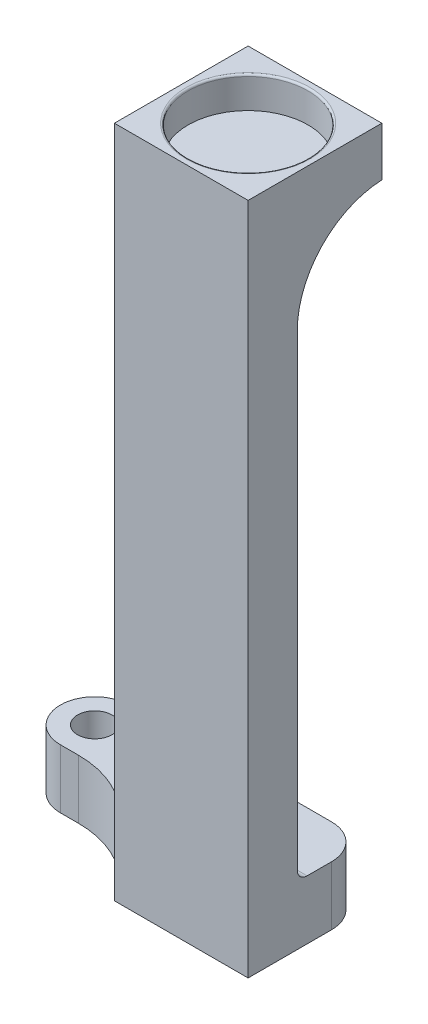
ISO-10303-21;
HEADER;
FILE_DESCRIPTION(('STEP AP214'),'2;1');
FILE_NAME('part.step','',(''),(''),'','','');
FILE_SCHEMA(('AUTOMOTIVE_DESIGN { 1 0 10303 214 1 1 1 1 }'));
ENDSEC;
DATA;
#1=APPLICATION_CONTEXT('core data for automotive mechanical design processes');
#2=APPLICATION_PROTOCOL_DEFINITION('international standard','automotive_design',2000,#1);
#3=PRODUCT_CONTEXT('',#1,'mechanical');
#4=PRODUCT('Part','Part','',(#3));
#5=PRODUCT_RELATED_PRODUCT_CATEGORY('part','',(#4));
#6=PRODUCT_DEFINITION_FORMATION('','',#4);
#7=PRODUCT_DEFINITION_CONTEXT('part definition',#1,'design');
#8=PRODUCT_DEFINITION('design','',#6,#7);
#9=PRODUCT_DEFINITION_SHAPE('','',#8);
#10=(LENGTH_UNIT() NAMED_UNIT(*) SI_UNIT(.MILLI.,.METRE.));
#11=(NAMED_UNIT(*) PLANE_ANGLE_UNIT() SI_UNIT($,.RADIAN.));
#12=(NAMED_UNIT(*) SI_UNIT($,.STERADIAN.) SOLID_ANGLE_UNIT());
#13=UNCERTAINTY_MEASURE_WITH_UNIT(LENGTH_MEASURE(1.E-05),#10,'distance_accuracy_value','');
#14=(GEOMETRIC_REPRESENTATION_CONTEXT(3) GLOBAL_UNCERTAINTY_ASSIGNED_CONTEXT((#13)) GLOBAL_UNIT_ASSIGNED_CONTEXT((#10,
#11,#12)) REPRESENTATION_CONTEXT('',''));
#15=CARTESIAN_POINT('',(0.,0.,0.));
#16=DIRECTION('',(0.,0.,1.));
#17=DIRECTION('',(1.,0.,0.));
#18=AXIS2_PLACEMENT_3D('',#15,#16,#17);
#19=CARTESIAN_POINT('',(-6.8,-63.5,1.8));
#20=DIRECTION('',(0.,0.,1.));
#21=DIRECTION('',(1.,0.,0.));
#22=AXIS2_PLACEMENT_3D('',#19,#20,#21);
#23=PLANE('',#22);
#24=DIRECTION('',(0.,1.,0.));
#25=VECTOR('',#24,1.);
#26=CARTESIAN_POINT('',(6.8,-63.5,1.8));
#27=LINE('',#26,#25);
#28=CARTESIAN_POINT('',(6.8,-56.5,1.8));
#29=VERTEX_POINT('',#28);
#30=CARTESIAN_POINT('',(6.8,-8.99110671719561,1.8));
#31=VERTEX_POINT('',#30);
#32=EDGE_CURVE('E162',#29,#31,#27,.T.);
#33=ORIENTED_EDGE('',*,*,#32,.F.);
#34=DIRECTION('',(1.,0.,0.));
#35=VECTOR('',#34,1.);
#36=CARTESIAN_POINT('',(-6.79999999999999,-56.5,1.8));
#37=LINE('',#36,#35);
#38=CARTESIAN_POINT('',(-6.8,-56.5,1.8));
#39=VERTEX_POINT('',#38);
#40=EDGE_CURVE('E242',#29,#39,#37,.F.);
#41=ORIENTED_EDGE('',*,*,#40,.T.);
#42=DIRECTION('',(0.,1.,0.));
#43=VECTOR('',#42,1.);
#44=CARTESIAN_POINT('',(-6.8,-63.5,1.8));
#45=LINE('',#44,#43);
#46=CARTESIAN_POINT('',(-6.8,-8.99110671719561,1.8));
#47=VERTEX_POINT('',#46);
#48=EDGE_CURVE('E164',#39,#47,#45,.T.);
#49=ORIENTED_EDGE('',*,*,#48,.T.);
#50=DIRECTION('',(1.,0.,0.));
#51=VECTOR('',#50,1.);
#52=CARTESIAN_POINT('',(-6.8,-8.99110671719561,1.8));
#53=LINE('',#52,#51);
#54=EDGE_CURVE('E194',#47,#31,#53,.T.);
#55=ORIENTED_EDGE('',*,*,#54,.T.);
#56=EDGE_LOOP('',(#33,#41,#49,#55));
#57=FACE_BOUND('',#56,.T.);
#58=ADVANCED_FACE('F39',(#57),#23,.F.);
#59=CARTESIAN_POINT('',(6.8,5.,-6.8));
#60=DIRECTION('',(-1.,0.,0.));
#61=DIRECTION('',(0.,0.,1.));
#62=AXIS2_PLACEMENT_3D('',#59,#60,#61);
#63=PLANE('',#62);
#64=DIRECTION('',(0.,0.,1.));
#65=VECTOR('',#64,1.);
#66=CARTESIAN_POINT('',(6.8,-63.5,6.8));
#67=LINE('',#66,#65);
#68=CARTESIAN_POINT('',(6.8,-63.5,-1.7));
#69=VERTEX_POINT('',#68);
#70=CARTESIAN_POINT('',(6.8,-63.5,6.8));
#71=VERTEX_POINT('',#70);
#72=EDGE_CURVE('E135',#69,#71,#67,.T.);
#73=ORIENTED_EDGE('',*,*,#72,.F.);
#74=DIRECTION('',(0.,-1.,0.));
#75=VECTOR('',#74,1.);
#76=CARTESIAN_POINT('',(6.8,5.,-1.7));
#77=LINE('',#76,#75);
#78=CARTESIAN_POINT('',(6.8,-57.5,-1.7));
#79=VERTEX_POINT('',#78);
#80=EDGE_CURVE('E229',#69,#79,#77,.F.);
#81=ORIENTED_EDGE('',*,*,#80,.T.);
#82=DIRECTION('',(0.,0.,1.));
#83=VECTOR('',#82,1.);
#84=CARTESIAN_POINT('',(6.8,-57.5,-5.2));
#85=LINE('',#84,#83);
#86=CARTESIAN_POINT('',(6.8,-57.5,0.799999999999997));
#87=VERTEX_POINT('',#86);
#88=EDGE_CURVE('E145',#79,#87,#85,.T.);
#89=ORIENTED_EDGE('',*,*,#88,.T.);
#90=CARTESIAN_POINT('',(6.8,-56.5,0.799999999999997));
#91=DIRECTION('',(-1.,0.,0.));
#92=DIRECTION('',(0.,0.,1.));
#93=AXIS2_PLACEMENT_3D('',#90,#91,#92);
#94=CIRCLE('',#93,1.);
#95=EDGE_CURVE('E11',#87,#29,#94,.T.);
#96=ORIENTED_EDGE('',*,*,#95,.T.);
#97=ORIENTED_EDGE('',*,*,#32,.T.);
#98=CARTESIAN_POINT('',(6.8,-8.99110671719561,-7.2));
#99=DIRECTION('',(-1.,0.,0.));
#100=DIRECTION('',(0.,0.,1.));
#101=AXIS2_PLACEMENT_3D('',#98,#99,#100);
#102=CIRCLE('',#101,9.);
#103=CARTESIAN_POINT('',(6.8,0.,-6.8));
#104=VERTEX_POINT('',#103);
#105=EDGE_CURVE('E197',#31,#104,#102,.T.);
#106=ORIENTED_EDGE('',*,*,#105,.T.);
#107=DIRECTION('',(0.,-1.,0.));
#108=VECTOR('',#107,1.);
#109=CARTESIAN_POINT('',(6.8,5.,-6.8));
#110=LINE('',#109,#108);
#111=CARTESIAN_POINT('',(6.8,5.,-6.8));
#112=VERTEX_POINT('',#111);
#113=EDGE_CURVE('E185',#112,#104,#110,.T.);
#114=ORIENTED_EDGE('',*,*,#113,.F.);
#115=DIRECTION('',(0.,0.,-1.));
#116=VECTOR('',#115,1.);
#117=CARTESIAN_POINT('',(6.8,5.,-6.8));
#118=LINE('',#117,#116);
#119=CARTESIAN_POINT('',(6.8,5.,6.8));
#120=VERTEX_POINT('',#119);
#121=EDGE_CURVE('E153',#120,#112,#118,.T.);
#122=ORIENTED_EDGE('',*,*,#121,.F.);
#123=DIRECTION('',(0.,-1.,0.));
#124=VECTOR('',#123,1.);
#125=CARTESIAN_POINT('',(6.8,5.,6.8));
#126=LINE('',#125,#124);
#127=EDGE_CURVE('E149',#120,#71,#126,.T.);
#128=ORIENTED_EDGE('',*,*,#127,.T.);
#129=EDGE_LOOP('',(#73,#81,#89,#96,#97,#106,#114,#122,#128));
#130=FACE_BOUND('',#129,.T.);
#131=ADVANCED_FACE('F150',(#130),#63,.F.);
#132=CARTESIAN_POINT('',(-6.8,5.,-6.8));
#133=DIRECTION('',(0.,0.,1.));
#134=DIRECTION('',(1.,0.,0.));
#135=AXIS2_PLACEMENT_3D('',#132,#133,#134);
#136=PLANE('',#135);
#137=DIRECTION('',(-1.,0.,0.));
#138=VECTOR('',#137,1.);
#139=CARTESIAN_POINT('',(-6.8,0.,-6.8));
#140=LINE('',#139,#138);
#141=CARTESIAN_POINT('',(-6.8,0.,-6.8));
#142=VERTEX_POINT('',#141);
#143=EDGE_CURVE('E172',#104,#142,#140,.T.);
#144=ORIENTED_EDGE('',*,*,#143,.T.);
#145=DIRECTION('',(0.,-1.,0.));
#146=VECTOR('',#145,1.);
#147=CARTESIAN_POINT('',(-6.8,5.,-6.8));
#148=LINE('',#147,#146);
#149=CARTESIAN_POINT('',(-6.8,5.,-6.8));
#150=VERTEX_POINT('',#149);
#151=EDGE_CURVE('E182',#150,#142,#148,.T.);
#152=ORIENTED_EDGE('',*,*,#151,.F.);
#153=DIRECTION('',(-1.,0.,0.));
#154=VECTOR('',#153,1.);
#155=CARTESIAN_POINT('',(-6.8,5.,-6.8));
#156=LINE('',#155,#154);
#157=EDGE_CURVE('E174',#112,#150,#156,.T.);
#158=ORIENTED_EDGE('',*,*,#157,.F.);
#159=ORIENTED_EDGE('',*,*,#113,.T.);
#160=EDGE_LOOP('',(#144,#152,#158,#159));
#161=FACE_BOUND('',#160,.T.);
#162=ADVANCED_FACE('F276',(#161),#136,.F.);
#163=CARTESIAN_POINT('',(-6.8,5.,-6.8));
#164=DIRECTION('',(1.,0.,0.));
#165=DIRECTION('',(0.,0.,-1.));
#166=AXIS2_PLACEMENT_3D('',#163,#164,#165);
#167=PLANE('',#166);
#168=ORIENTED_EDGE('',*,*,#48,.F.);
#169=DIRECTION('',(0.,0.,1.));
#170=VECTOR('',#169,1.);
#171=CARTESIAN_POINT('',(-6.8,-56.5,6.8));
#172=LINE('',#171,#170);
#173=CARTESIAN_POINT('',(-6.8,-56.5,6.8));
#174=VERTEX_POINT('',#173);
#175=EDGE_CURVE('E231',#39,#174,#172,.T.);
#176=ORIENTED_EDGE('',*,*,#175,.T.);
#177=DIRECTION('',(0.,-1.,0.));
#178=VECTOR('',#177,1.);
#179=CARTESIAN_POINT('',(-6.8,5.,6.8));
#180=LINE('',#179,#178);
#181=CARTESIAN_POINT('',(-6.8,5.,6.8));
#182=VERTEX_POINT('',#181);
#183=EDGE_CURVE('E180',#182,#174,#180,.T.);
#184=ORIENTED_EDGE('',*,*,#183,.F.);
#185=DIRECTION('',(0.,0.,1.));
#186=VECTOR('',#185,1.);
#187=CARTESIAN_POINT('',(-6.8,5.,-6.8));
#188=LINE('',#187,#186);
#189=EDGE_CURVE('E176',#150,#182,#188,.T.);
#190=ORIENTED_EDGE('',*,*,#189,.F.);
#191=ORIENTED_EDGE('',*,*,#151,.T.);
#192=CARTESIAN_POINT('',(-6.8,-8.99110671719561,-7.2));
#193=DIRECTION('',(1.,0.,0.));
#194=DIRECTION('',(0.,0.,-1.));
#195=AXIS2_PLACEMENT_3D('',#192,#193,#194);
#196=CIRCLE('',#195,9.);
#197=EDGE_CURVE('E199',#142,#47,#196,.T.);
#198=ORIENTED_EDGE('',*,*,#197,.T.);
#199=EDGE_LOOP('',(#168,#176,#184,#190,#191,#198));
#200=FACE_BOUND('',#199,.T.);
#201=ADVANCED_FACE('F295',(#200),#167,.F.);
#202=CARTESIAN_POINT('',(-6.8,5.,6.8));
#203=DIRECTION('',(0.,0.,-1.));
#204=DIRECTION('',(-1.,0.,0.));
#205=AXIS2_PLACEMENT_3D('',#202,#203,#204);
#206=PLANE('',#205);
#207=ORIENTED_EDGE('',*,*,#183,.T.);
#208=CARTESIAN_POINT('',(-6.8,-63.5,6.8));
#209=VERTEX_POINT('',#208);
#210=EDGE_CURVE('E156',#174,#209,#180,.T.);
#211=ORIENTED_EDGE('',*,*,#210,.T.);
#212=DIRECTION('',(-1.,0.,0.));
#213=VECTOR('',#212,1.);
#214=CARTESIAN_POINT('',(-6.8,-63.5,6.8));
#215=LINE('',#214,#213);
#216=EDGE_CURVE('E140',#71,#209,#215,.T.);
#217=ORIENTED_EDGE('',*,*,#216,.F.);
#218=ORIENTED_EDGE('',*,*,#127,.F.);
#219=DIRECTION('',(1.,0.,0.));
#220=VECTOR('',#219,1.);
#221=CARTESIAN_POINT('',(-6.8,5.,6.8));
#222=LINE('',#221,#220);
#223=EDGE_CURVE('E157',#182,#120,#222,.T.);
#224=ORIENTED_EDGE('',*,*,#223,.F.);
#225=EDGE_LOOP('',(#207,#211,#217,#218,#224));
#226=FACE_BOUND('',#225,.T.);
#227=ADVANCED_FACE('F160',(#226),#206,.F.);
#228=CARTESIAN_POINT('',(0.,5.,0.));
#229=DIRECTION('',(0.,1.,0.));
#230=DIRECTION('',(0.,0.,1.));
#231=AXIS2_PLACEMENT_3D('',#228,#229,#230);
#232=PLANE('',#231);
#233=CARTESIAN_POINT('',(0.,5.,0.));
#234=DIRECTION('',(0.,1.,0.));
#235=DIRECTION('',(0.,0.,1.));
#236=AXIS2_PLACEMENT_3D('',#233,#234,#235);
#237=CIRCLE('',#236,6.3);
#238=CARTESIAN_POINT('',(0.,5.,6.3));
#239=VERTEX_POINT('',#238);
#240=EDGE_CURVE('E191',#239,#239,#237,.F.);
#241=ORIENTED_EDGE('',*,*,#240,.T.);
#242=EDGE_LOOP('',(#241));
#243=FACE_BOUND('',#242,.T.);
#244=ORIENTED_EDGE('',*,*,#121,.T.);
#245=ORIENTED_EDGE('',*,*,#157,.T.);
#246=ORIENTED_EDGE('',*,*,#189,.T.);
#247=ORIENTED_EDGE('',*,*,#223,.T.);
#248=EDGE_LOOP('',(#244,#245,#246,#247));
#249=FACE_BOUND('',#248,.T.);
#250=ADVANCED_FACE('F288',(#243,#249),#232,.T.);
#251=CARTESIAN_POINT('',(0.,1.8,0.));
#252=DIRECTION('',(0.,1.,0.));
#253=DIRECTION('',(0.,0.,1.));
#254=AXIS2_PLACEMENT_3D('',#251,#252,#253);
#255=CYLINDRICAL_SURFACE('',#254,6.1);
#256=CARTESIAN_POINT('',(0.,4.8,0.));
#257=DIRECTION('',(0.,1.,0.));
#258=DIRECTION('',(0.,0.,1.));
#259=AXIS2_PLACEMENT_3D('',#256,#257,#258);
#260=CIRCLE('',#259,6.1);
#261=CARTESIAN_POINT('',(0.,4.8,6.1));
#262=VERTEX_POINT('',#261);
#263=EDGE_CURVE('E188',#262,#262,#260,.T.);
#264=ORIENTED_EDGE('',*,*,#263,.T.);
#265=EDGE_LOOP('',(#264));
#266=FACE_BOUND('',#265,.T.);
#267=CARTESIAN_POINT('',(0.,1.8,0.));
#268=DIRECTION('',(0.,1.,0.));
#269=DIRECTION('',(0.,0.,1.));
#270=AXIS2_PLACEMENT_3D('',#267,#268,#269);
#271=CIRCLE('',#270,6.1);
#272=CARTESIAN_POINT('',(0.,1.8,6.1));
#273=VERTEX_POINT('',#272);
#274=EDGE_CURVE('E169',#273,#273,#271,.T.);
#275=ORIENTED_EDGE('',*,*,#274,.F.);
#276=EDGE_LOOP('',(#275));
#277=FACE_BOUND('',#276,.T.);
#278=ADVANCED_FACE('F284',(#266,#277),#255,.F.);
#279=CARTESIAN_POINT('',(0.,1.8,0.));
#280=DIRECTION('',(0.,1.,0.));
#281=DIRECTION('',(0.,0.,1.));
#282=AXIS2_PLACEMENT_3D('',#279,#280,#281);
#283=PLANE('',#282);
#284=ORIENTED_EDGE('',*,*,#274,.T.);
#285=EDGE_LOOP('',(#284));
#286=FACE_BOUND('',#285,.T.);
#287=ADVANCED_FACE('F281',(#286),#283,.T.);
#288=CARTESIAN_POINT('',(0.,-63.5,0.));
#289=DIRECTION('',(0.,-1.,0.));
#290=DIRECTION('',(0.,0.,-1.));
#291=AXIS2_PLACEMENT_3D('',#288,#289,#290);
#292=PLANE('',#291);
#293=CARTESIAN_POINT('',(-10.3,-63.5,-1.7));
#294=DIRECTION('',(0.,1.,0.));
#295=DIRECTION('',(0.,0.,1.));
#296=AXIS2_PLACEMENT_3D('',#293,#294,#295);
#297=CIRCLE('',#296,1.75);
#298=CARTESIAN_POINT('',(-10.3,-63.5,0.0499999999999956));
#299=VERTEX_POINT('',#298);
#300=EDGE_CURVE('E341',#299,#299,#297,.T.);
#301=ORIENTED_EDGE('',*,*,#300,.T.);
#302=EDGE_LOOP('',(#301));
#303=FACE_BOUND('',#302,.T.);
#304=CARTESIAN_POINT('',(-17.3,-63.5,-1.7));
#305=DIRECTION('',(0.,1.,0.));
#306=DIRECTION('',(0.,0.,1.));
#307=AXIS2_PLACEMENT_3D('',#304,#305,#306);
#308=CIRCLE('',#307,1.75);
#309=CARTESIAN_POINT('',(-17.3,-63.5,0.0499999999999964));
#310=VERTEX_POINT('',#309);
#311=EDGE_CURVE('E235',#310,#310,#308,.T.);
#312=ORIENTED_EDGE('',*,*,#311,.T.);
#313=EDGE_LOOP('',(#312));
#314=FACE_BOUND('',#313,.T.);
#315=DIRECTION('',(-1.,0.,0.));
#316=VECTOR('',#315,1.);
#317=CARTESIAN_POINT('',(6.8,-63.5,1.8));
#318=LINE('',#317,#316);
#319=CARTESIAN_POINT('',(-15.4602540378444,-63.5,1.8));
#320=VERTEX_POINT('',#319);
#321=CARTESIAN_POINT('',(-17.3,-63.5,1.8));
#322=VERTEX_POINT('',#321);
#323=EDGE_CURVE('E337',#320,#322,#318,.T.);
#324=ORIENTED_EDGE('',*,*,#323,.T.);
#325=CARTESIAN_POINT('',(-17.3,-63.5,-1.7));
#326=DIRECTION('',(0.,-1.,0.));
#327=DIRECTION('',(0.,0.,-1.));
#328=AXIS2_PLACEMENT_3D('',#325,#326,#327);
#329=CIRCLE('',#328,3.5);
#330=CARTESIAN_POINT('',(-20.8,-63.5,-1.7));
#331=VERTEX_POINT('',#330);
#332=EDGE_CURVE('E222',#322,#331,#329,.T.);
#333=ORIENTED_EDGE('',*,*,#332,.T.);
#334=CARTESIAN_POINT('',(-17.3,-63.5,-1.7));
#335=DIRECTION('',(0.,-1.,0.));
#336=DIRECTION('',(0.,0.,-1.));
#337=AXIS2_PLACEMENT_3D('',#334,#335,#336);
#338=CIRCLE('',#337,3.5);
#339=CARTESIAN_POINT('',(-17.3,-63.5,-5.2));
#340=VERTEX_POINT('',#339);
#341=EDGE_CURVE('E220',#331,#340,#338,.T.);
#342=ORIENTED_EDGE('',*,*,#341,.T.);
#343=DIRECTION('',(-1.,0.,0.));
#344=VECTOR('',#343,1.);
#345=CARTESIAN_POINT('',(6.8,-63.5,-5.2));
#346=LINE('',#345,#344);
#347=CARTESIAN_POINT('',(3.3,-63.5,-5.2));
#348=VERTEX_POINT('',#347);
#349=EDGE_CURVE('E343',#348,#340,#346,.T.);
#350=ORIENTED_EDGE('',*,*,#349,.F.);
#351=CARTESIAN_POINT('',(3.3,-63.5,-1.7));
#352=DIRECTION('',(0.,-1.,0.));
#353=DIRECTION('',(0.,0.,-1.));
#354=AXIS2_PLACEMENT_3D('',#351,#352,#353);
#355=CIRCLE('',#354,3.5);
#356=EDGE_CURVE('E143',#348,#69,#355,.T.);
#357=ORIENTED_EDGE('',*,*,#356,.T.);
#358=ORIENTED_EDGE('',*,*,#72,.T.);
#359=ORIENTED_EDGE('',*,*,#216,.T.);
#360=CARTESIAN_POINT('',(-15.4602540378444,-63.5,11.8));
#361=DIRECTION('',(0.,-1.,0.));
#362=DIRECTION('',(0.,0.,-1.));
#363=AXIS2_PLACEMENT_3D('',#360,#361,#362);
#364=CIRCLE('',#363,10.);
#365=EDGE_CURVE('E208',#209,#320,#364,.F.);
#366=ORIENTED_EDGE('',*,*,#365,.T.);
#367=EDGE_LOOP('',(#324,#333,#342,#350,#357,#358,#359,#366));
#368=FACE_BOUND('',#367,.T.);
#369=ADVANCED_FACE('F138',(#303,#314,#368),#292,.T.);
#370=CARTESIAN_POINT('',(0.,4.8,0.));
#371=DIRECTION('',(0.,1.,0.));
#372=DIRECTION('',(0.,0.,1.));
#373=AXIS2_PLACEMENT_3D('',#370,#371,#372);
#374=TOROIDAL_SURFACE('',#373,6.3,0.2);
#375=ORIENTED_EDGE('',*,*,#240,.F.);
#376=EDGE_LOOP('',(#375));
#377=FACE_BOUND('',#376,.T.);
#378=ORIENTED_EDGE('',*,*,#263,.F.);
#379=EDGE_LOOP('',(#378));
#380=FACE_BOUND('',#379,.T.);
#381=ADVANCED_FACE('F302',(#377,#380),#374,.T.);
#382=CARTESIAN_POINT('',(0.,-8.99110671719561,-7.2));
#383=DIRECTION('',(1.,0.,0.));
#384=DIRECTION('',(0.,0.,-1.));
#385=AXIS2_PLACEMENT_3D('',#382,#383,#384);
#386=CYLINDRICAL_SURFACE('',#385,9.);
#387=ORIENTED_EDGE('',*,*,#197,.F.);
#388=ORIENTED_EDGE('',*,*,#143,.F.);
#389=ORIENTED_EDGE('',*,*,#105,.F.);
#390=ORIENTED_EDGE('',*,*,#54,.F.);
#391=EDGE_LOOP('',(#387,#388,#389,#390));
#392=FACE_BOUND('',#391,.T.);
#393=ADVANCED_FACE('F304',(#392),#386,.F.);
#394=CARTESIAN_POINT('',(0.,0.,1.8));
#395=DIRECTION('',(0.,0.,1.));
#396=DIRECTION('',(1.,0.,0.));
#397=AXIS2_PLACEMENT_3D('',#394,#395,#396);
#398=PLANE('',#397);
#399=DIRECTION('',(1.,0.,0.));
#400=VECTOR('',#399,1.);
#401=CARTESIAN_POINT('',(6.8,-57.5,1.8));
#402=LINE('',#401,#400);
#403=CARTESIAN_POINT('',(-17.3,-57.5,1.8));
#404=VERTEX_POINT('',#403);
#405=CARTESIAN_POINT('',(-15.4602540378444,-57.5,1.8));
#406=VERTEX_POINT('',#405);
#407=EDGE_CURVE('E340',#404,#406,#402,.T.);
#408=ORIENTED_EDGE('',*,*,#407,.F.);
#409=DIRECTION('',(0.,1.,0.));
#410=VECTOR('',#409,1.);
#411=CARTESIAN_POINT('',(-17.3,-63.5,1.8));
#412=LINE('',#411,#410);
#413=EDGE_CURVE('E216',#404,#322,#412,.F.);
#414=ORIENTED_EDGE('',*,*,#413,.T.);
#415=ORIENTED_EDGE('',*,*,#323,.F.);
#416=DIRECTION('',(0.,-1.,0.));
#417=VECTOR('',#416,1.);
#418=CARTESIAN_POINT('',(-15.4602540378444,-57.5,1.8));
#419=LINE('',#418,#417);
#420=EDGE_CURVE('E202',#320,#406,#419,.F.);
#421=ORIENTED_EDGE('',*,*,#420,.T.);
#422=EDGE_LOOP('',(#408,#414,#415,#421));
#423=FACE_BOUND('',#422,.T.);
#424=ADVANCED_FACE('F307',(#423),#398,.T.);
#425=CARTESIAN_POINT('',(6.8,-57.5,-5.2));
#426=DIRECTION('',(0.,-1.,0.));
#427=DIRECTION('',(0.,0.,-1.));
#428=AXIS2_PLACEMENT_3D('',#425,#426,#427);
#429=PLANE('',#428);
#430=CARTESIAN_POINT('',(-10.3,-57.5,-1.7));
#431=DIRECTION('',(0.,1.,0.));
#432=DIRECTION('',(0.,0.,1.));
#433=AXIS2_PLACEMENT_3D('',#430,#431,#432);
#434=CIRCLE('',#433,1.75);
#435=CARTESIAN_POINT('',(-10.3,-57.5,0.0499999999999956));
#436=VERTEX_POINT('',#435);
#437=EDGE_CURVE('E346',#436,#436,#434,.T.);
#438=ORIENTED_EDGE('',*,*,#437,.F.);
#439=EDGE_LOOP('',(#438));
#440=FACE_BOUND('',#439,.T.);
#441=CARTESIAN_POINT('',(-17.3,-57.5,-1.7));
#442=DIRECTION('',(0.,1.,0.));
#443=DIRECTION('',(0.,0.,1.));
#444=AXIS2_PLACEMENT_3D('',#441,#442,#443);
#445=CIRCLE('',#444,1.75);
#446=CARTESIAN_POINT('',(-17.3,-57.5,0.0499999999999964));
#447=VERTEX_POINT('',#446);
#448=EDGE_CURVE('E361',#447,#447,#445,.T.);
#449=ORIENTED_EDGE('',*,*,#448,.F.);
#450=EDGE_LOOP('',(#449));
#451=FACE_BOUND('',#450,.T.);
#452=CARTESIAN_POINT('',(-15.4602540378444,-57.5,11.8));
#453=DIRECTION('',(0.,-1.,0.));
#454=DIRECTION('',(0.,0.,-1.));
#455=AXIS2_PLACEMENT_3D('',#452,#453,#454);
#456=CIRCLE('',#455,10.);
#457=CARTESIAN_POINT('',(-7.8,-57.5,5.37189700800548));
#458=VERTEX_POINT('',#457);
#459=EDGE_CURVE('E205',#406,#458,#456,.T.);
#460=ORIENTED_EDGE('',*,*,#459,.T.);
#461=DIRECTION('',(0.,0.,1.));
#462=VECTOR('',#461,1.);
#463=CARTESIAN_POINT('',(-7.8,-57.5,1.8));
#464=LINE('',#463,#462);
#465=CARTESIAN_POINT('',(-7.8,-57.5,0.799999999999997));
#466=VERTEX_POINT('',#465);
#467=EDGE_CURVE('E240',#458,#466,#464,.F.);
#468=ORIENTED_EDGE('',*,*,#467,.T.);
#469=DIRECTION('',(1.,0.,0.));
#470=VECTOR('',#469,1.);
#471=CARTESIAN_POINT('',(6.8,-57.5,0.799999999999997));
#472=LINE('',#471,#470);
#473=EDGE_CURVE('E238',#466,#87,#472,.T.);
#474=ORIENTED_EDGE('',*,*,#473,.T.);
#475=ORIENTED_EDGE('',*,*,#88,.F.);
#476=CARTESIAN_POINT('',(3.3,-57.5,-1.7));
#477=DIRECTION('',(0.,-1.,0.));
#478=DIRECTION('',(0.,0.,-1.));
#479=AXIS2_PLACEMENT_3D('',#476,#477,#478);
#480=CIRCLE('',#479,3.5);
#481=CARTESIAN_POINT('',(3.3,-57.5,-5.2));
#482=VERTEX_POINT('',#481);
#483=EDGE_CURVE('E210',#79,#482,#480,.F.);
#484=ORIENTED_EDGE('',*,*,#483,.T.);
#485=DIRECTION('',(1.,0.,0.));
#486=VECTOR('',#485,1.);
#487=CARTESIAN_POINT('',(6.8,-57.5,-5.2));
#488=LINE('',#487,#486);
#489=CARTESIAN_POINT('',(-17.3,-57.5,-5.2));
#490=VERTEX_POINT('',#489);
#491=EDGE_CURVE('E349',#490,#482,#488,.T.);
#492=ORIENTED_EDGE('',*,*,#491,.F.);
#493=CARTESIAN_POINT('',(-17.3,-57.5,-1.7));
#494=DIRECTION('',(0.,-1.,0.));
#495=DIRECTION('',(0.,0.,-1.));
#496=AXIS2_PLACEMENT_3D('',#493,#494,#495);
#497=CIRCLE('',#496,3.5);
#498=CARTESIAN_POINT('',(-20.8,-57.5,-1.7));
#499=VERTEX_POINT('',#498);
#500=EDGE_CURVE('E212',#490,#499,#497,.F.);
#501=ORIENTED_EDGE('',*,*,#500,.T.);
#502=CARTESIAN_POINT('',(-17.3,-57.5,-1.7));
#503=DIRECTION('',(0.,-1.,0.));
#504=DIRECTION('',(0.,0.,-1.));
#505=AXIS2_PLACEMENT_3D('',#502,#503,#504);
#506=CIRCLE('',#505,3.5);
#507=EDGE_CURVE('E214',#499,#404,#506,.F.);
#508=ORIENTED_EDGE('',*,*,#507,.T.);
#509=ORIENTED_EDGE('',*,*,#407,.T.);
#510=EDGE_LOOP('',(#460,#468,#474,#475,#484,#492,#501,#508,#509));
#511=FACE_BOUND('',#510,.T.);
#512=ADVANCED_FACE('F313',(#440,#451,#511),#429,.F.);
#513=CARTESIAN_POINT('',(0.,0.,-5.2));
#514=DIRECTION('',(0.,0.,1.));
#515=DIRECTION('',(1.,0.,0.));
#516=AXIS2_PLACEMENT_3D('',#513,#514,#515);
#517=PLANE('',#516);
#518=ORIENTED_EDGE('',*,*,#349,.T.);
#519=DIRECTION('',(0.,1.,0.));
#520=VECTOR('',#519,1.);
#521=CARTESIAN_POINT('',(-17.3,0.,-5.2));
#522=LINE('',#521,#520);
#523=EDGE_CURVE('E227',#340,#490,#522,.T.);
#524=ORIENTED_EDGE('',*,*,#523,.T.);
#525=ORIENTED_EDGE('',*,*,#491,.T.);
#526=DIRECTION('',(0.,-1.,0.));
#527=VECTOR('',#526,1.);
#528=CARTESIAN_POINT('',(3.3,0.,-5.2));
#529=LINE('',#528,#527);
#530=EDGE_CURVE('E224',#482,#348,#529,.T.);
#531=ORIENTED_EDGE('',*,*,#530,.T.);
#532=EDGE_LOOP('',(#518,#524,#525,#531));
#533=FACE_BOUND('',#532,.T.);
#534=ADVANCED_FACE('F371',(#533),#517,.F.);
#535=CARTESIAN_POINT('',(-17.3,-63.5,-1.7));
#536=DIRECTION('',(0.,1.,0.));
#537=DIRECTION('',(0.,0.,1.));
#538=AXIS2_PLACEMENT_3D('',#535,#536,#537);
#539=CYLINDRICAL_SURFACE('',#538,1.75);
#540=ORIENTED_EDGE('',*,*,#311,.F.);
#541=EDGE_LOOP('',(#540));
#542=FACE_BOUND('',#541,.T.);
#543=ORIENTED_EDGE('',*,*,#448,.T.);
#544=EDGE_LOOP('',(#543));
#545=FACE_BOUND('',#544,.T.);
#546=ADVANCED_FACE('F380',(#542,#545),#539,.F.);
#547=CARTESIAN_POINT('',(-10.3,-63.5,-1.7));
#548=DIRECTION('',(0.,1.,0.));
#549=DIRECTION('',(0.,0.,1.));
#550=AXIS2_PLACEMENT_3D('',#547,#548,#549);
#551=CYLINDRICAL_SURFACE('',#550,1.75);
#552=ORIENTED_EDGE('',*,*,#300,.F.);
#553=EDGE_LOOP('',(#552));
#554=FACE_BOUND('',#553,.T.);
#555=ORIENTED_EDGE('',*,*,#437,.T.);
#556=EDGE_LOOP('',(#555));
#557=FACE_BOUND('',#556,.T.);
#558=ADVANCED_FACE('F367',(#554,#557),#551,.F.);
#559=CARTESIAN_POINT('',(-15.4602540378444,5.,11.8));
#560=DIRECTION('',(0.,1.,0.));
#561=DIRECTION('',(0.,0.,1.));
#562=AXIS2_PLACEMENT_3D('',#559,#560,#561);
#563=CYLINDRICAL_SURFACE('',#562,10.);
#564=ORIENTED_EDGE('',*,*,#365,.F.);
#565=ORIENTED_EDGE('',*,*,#210,.F.);
#566=CARTESIAN_POINT('',(-6.8,-56.5,6.8));
#567=CARTESIAN_POINT('',(-6.79996241698524,-56.5306581582051,6.80007270188269));
#568=CARTESIAN_POINT('',(-6.80140781492477,-56.5612082024637,6.7975612493534));
#569=CARTESIAN_POINT('',(-6.80691017471412,-56.6210097129236,6.78804540979888));
#570=CARTESIAN_POINT('',(-6.81093678090053,-56.6502721020879,6.78109324996321));
#571=CARTESIAN_POINT('',(-6.82258570702137,-56.7144541410767,6.76106742795712));
#572=CARTESIAN_POINT('',(-6.8308654559841,-56.7488993467378,6.74688091863335));
#573=CARTESIAN_POINT('',(-6.85022190036032,-56.8148153940676,6.71396855977854));
#574=CARTESIAN_POINT('',(-6.86131228139221,-56.8462706153779,6.69522051746347));
#575=CARTESIAN_POINT('',(-6.89283907060472,-56.9239361955104,6.64240243691979));
#576=CARTESIAN_POINT('',(-6.91490785481767,-56.9677767613146,6.6058571469048));
#577=CARTESIAN_POINT('',(-6.96267283137027,-57.0487229778996,6.52807262198036));
#578=CARTESIAN_POINT('',(-6.98837704141629,-57.0858133165157,6.4868230520952));
#579=CARTESIAN_POINT('',(-7.03954079372588,-57.150544813206,6.40615006614558));
#580=CARTESIAN_POINT('',(-7.06472255886322,-57.1787750196376,6.36701642086825));
#581=CARTESIAN_POINT('',(-7.1168693584891,-57.2312315451114,6.28726816802198));
#582=CARTESIAN_POINT('',(-7.14383569040262,-57.2554549052909,6.24665249282116));
#583=CARTESIAN_POINT('',(-7.22714421232703,-57.3227739388048,6.12322983448704));
#584=CARTESIAN_POINT('',(-7.28581927819101,-57.3604263329647,6.03896905435089));
#585=CARTESIAN_POINT('',(-7.38203031953639,-57.4093084065294,5.90543080358487));
#586=CARTESIAN_POINT('',(-7.41795072996427,-57.4249664855892,5.85650693567065));
#587=CARTESIAN_POINT('',(-7.49127757521894,-57.4519550545232,5.75854750294416));
#588=CARTESIAN_POINT('',(-7.52868415327536,-57.4632851261626,5.70951192779749));
#589=CARTESIAN_POINT('',(-7.60445788136714,-57.4814626058682,5.61208940406404));
#590=CARTESIAN_POINT('',(-7.6428130678401,-57.4883501922478,5.5637006323883));
#591=CARTESIAN_POINT('',(-7.72062525737671,-57.4976101747025,5.46738609806948));
#592=CARTESIAN_POINT('',(-7.76008220302768,-57.4999828056079,5.41946031147477));
#593=CARTESIAN_POINT('',(-7.8,-57.5,5.37189700800548));
#594=B_SPLINE_CURVE_WITH_KNOTS('',3,(#566,#567,#568,#569,#570,#571,#572,#573,#574,#575,#576,
#577,#578,#579,#580,#581,#582,#583,#584,#585,#586,#587,#588,#589,#590,#591,#592,#593),
.UNSPECIFIED.,.F.,.F.,(4,2,2,2,2,2,2,2,2,2,2,2,2,4),(0.,0.0916631888219628,0.182267692746217,
0.296115090555361,0.410527861693085,0.593082601732288,0.776046421902613,0.939099505080279,
1.10227246269717,1.42912596359237,1.61704972646573,1.80499164466257,1.99120903539114,
2.17741674037437),.UNSPECIFIED.);
#595=EDGE_CURVE('E49',#174,#458,#594,.T.);
#596=ORIENTED_EDGE('',*,*,#595,.T.);
#597=ORIENTED_EDGE('',*,*,#459,.F.);
#598=ORIENTED_EDGE('',*,*,#420,.F.);
#599=EDGE_LOOP('',(#564,#565,#596,#597,#598));
#600=FACE_BOUND('',#599,.T.);
#601=ADVANCED_FACE('F249',(#600),#563,.F.);
#602=CARTESIAN_POINT('',(-17.3,0.,-1.7));
#603=DIRECTION('',(0.,1.,0.));
#604=DIRECTION('',(0.,0.,1.));
#605=AXIS2_PLACEMENT_3D('',#602,#603,#604);
#606=CYLINDRICAL_SURFACE('',#605,3.5);
#607=ORIENTED_EDGE('',*,*,#523,.F.);
#608=ORIENTED_EDGE('',*,*,#341,.F.);
#609=DIRECTION('',(0.,1.,0.));
#610=VECTOR('',#609,1.);
#611=CARTESIAN_POINT('',(-20.8,-63.5,-1.7));
#612=LINE('',#611,#610);
#613=EDGE_CURVE('E232',#499,#331,#612,.F.);
#614=ORIENTED_EDGE('',*,*,#613,.F.);
#615=ORIENTED_EDGE('',*,*,#500,.F.);
#616=EDGE_LOOP('',(#607,#608,#614,#615));
#617=FACE_BOUND('',#616,.T.);
#618=ADVANCED_FACE('F263',(#617),#606,.T.);
#619=CARTESIAN_POINT('',(-17.3,-63.5,-1.7));
#620=DIRECTION('',(0.,-1.,0.));
#621=DIRECTION('',(0.,0.,-1.));
#622=AXIS2_PLACEMENT_3D('',#619,#620,#621);
#623=CYLINDRICAL_SURFACE('',#622,3.5);
#624=ORIENTED_EDGE('',*,*,#332,.F.);
#625=ORIENTED_EDGE('',*,*,#413,.F.);
#626=ORIENTED_EDGE('',*,*,#507,.F.);
#627=ORIENTED_EDGE('',*,*,#613,.T.);
#628=EDGE_LOOP('',(#624,#625,#626,#627));
#629=FACE_BOUND('',#628,.T.);
#630=ADVANCED_FACE('F261',(#629),#623,.T.);
#631=CARTESIAN_POINT('',(3.3,0.,-1.7));
#632=DIRECTION('',(0.,-1.,0.));
#633=DIRECTION('',(0.,0.,-1.));
#634=AXIS2_PLACEMENT_3D('',#631,#632,#633);
#635=CYLINDRICAL_SURFACE('',#634,3.5);
#636=ORIENTED_EDGE('',*,*,#483,.F.);
#637=ORIENTED_EDGE('',*,*,#80,.F.);
#638=ORIENTED_EDGE('',*,*,#356,.F.);
#639=ORIENTED_EDGE('',*,*,#530,.F.);
#640=EDGE_LOOP('',(#636,#637,#638,#639));
#641=FACE_BOUND('',#640,.T.);
#642=ADVANCED_FACE('F258',(#641),#635,.T.);
#643=CARTESIAN_POINT('',(6.8,-56.5,0.799999999999997));
#644=DIRECTION('',(-1.,0.,0.));
#645=DIRECTION('',(0.,0.,1.));
#646=AXIS2_PLACEMENT_3D('',#643,#644,#645);
#647=CYLINDRICAL_SURFACE('',#646,1.);
#648=ORIENTED_EDGE('',*,*,#95,.F.);
#649=ORIENTED_EDGE('',*,*,#473,.F.);
#650=CARTESIAN_POINT('',(-7.8,-56.5,0.799999999999997));
#651=DIRECTION('',(-0.707106781186547,0.,0.707106781186548));
#652=DIRECTION('',(-0.707106781186548,0.,-0.707106781186547));
#653=AXIS2_PLACEMENT_3D('',#650,#651,#652);
#654=ELLIPSE('',#653,1.4142135623731,1.);
#655=EDGE_CURVE('E43',#39,#466,#654,.F.);
#656=ORIENTED_EDGE('',*,*,#655,.F.);
#657=ORIENTED_EDGE('',*,*,#40,.F.);
#658=EDGE_LOOP('',(#648,#649,#656,#657));
#659=FACE_BOUND('',#658,.T.);
#660=ADVANCED_FACE('F41',(#659),#647,.F.);
#661=CARTESIAN_POINT('',(-7.8,-56.5,-6.8));
#662=DIRECTION('',(0.,0.,-1.));
#663=DIRECTION('',(-1.,0.,0.));
#664=AXIS2_PLACEMENT_3D('',#661,#662,#663);
#665=CYLINDRICAL_SURFACE('',#664,1.);
#666=ORIENTED_EDGE('',*,*,#655,.T.);
#667=ORIENTED_EDGE('',*,*,#467,.F.);
#668=ORIENTED_EDGE('',*,*,#595,.F.);
#669=ORIENTED_EDGE('',*,*,#175,.F.);
#670=EDGE_LOOP('',(#666,#667,#668,#669));
#671=FACE_BOUND('',#670,.T.);
#672=ADVANCED_FACE('F253',(#671),#665,.F.);
#673=CLOSED_SHELL('',(#58,#131,#162,#201,#227,#250,#278,#287,#369,#381,#393,#424,#512,#534,#546,
#558,#601,#618,#630,#642,#660,#672));
#674=MANIFOLD_SOLID_BREP('B2',#673);
#675=ADVANCED_BREP_SHAPE_REPRESENTATION('',(#18,#674),#14);
#676=SHAPE_DEFINITION_REPRESENTATION(#9,#675);
ENDSEC;
END-ISO-10303-21;
